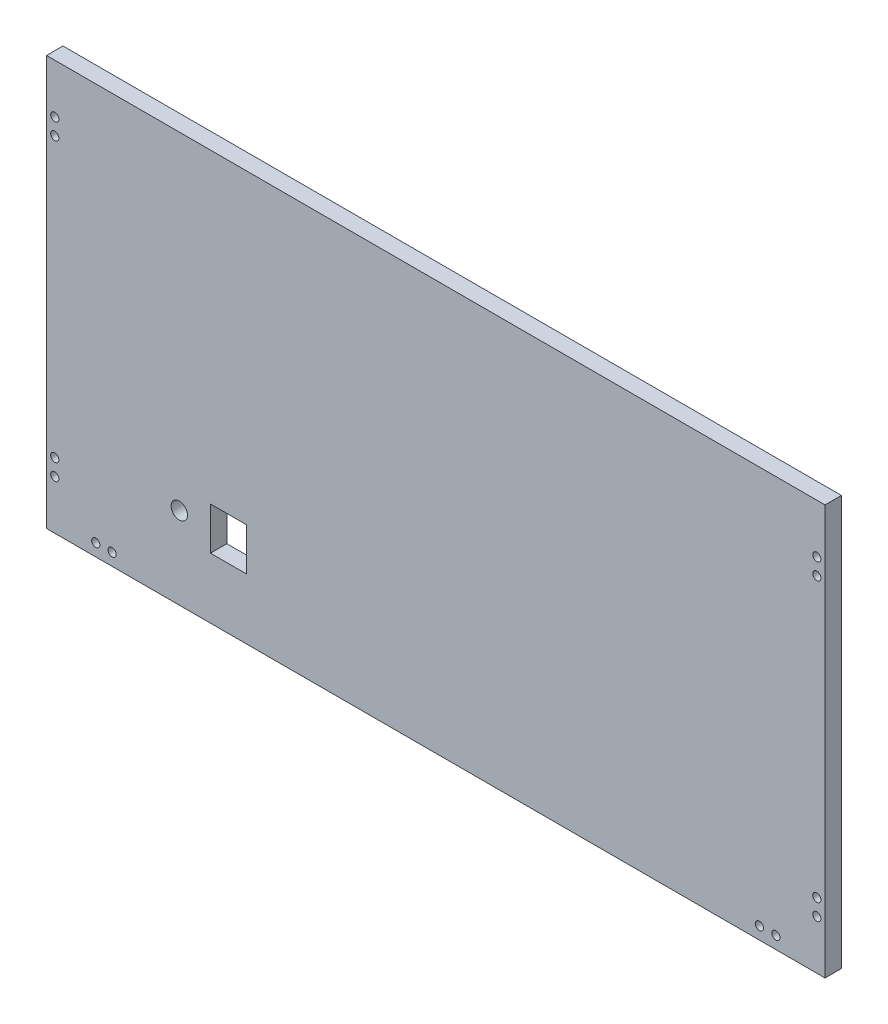
ISO-10303-21;
HEADER;
FILE_DESCRIPTION(('STEP AP214'),'2;1');
FILE_NAME('part.step','',(''),(''),'','','');
FILE_SCHEMA(('AUTOMOTIVE_DESIGN { 1 0 10303 214 1 1 1 1 }'));
ENDSEC;
DATA;
#1=APPLICATION_CONTEXT('core data for automotive mechanical design processes');
#2=APPLICATION_PROTOCOL_DEFINITION('international standard','automotive_design',2000,#1);
#3=PRODUCT_CONTEXT('',#1,'mechanical');
#4=PRODUCT('Part','Part','',(#3));
#5=PRODUCT_RELATED_PRODUCT_CATEGORY('part','',(#4));
#6=PRODUCT_DEFINITION_FORMATION('','',#4);
#7=PRODUCT_DEFINITION_CONTEXT('part definition',#1,'design');
#8=PRODUCT_DEFINITION('design','',#6,#7);
#9=PRODUCT_DEFINITION_SHAPE('','',#8);
#10=(LENGTH_UNIT() NAMED_UNIT(*) SI_UNIT(.MILLI.,.METRE.));
#11=(NAMED_UNIT(*) PLANE_ANGLE_UNIT() SI_UNIT($,.RADIAN.));
#12=(NAMED_UNIT(*) SI_UNIT($,.STERADIAN.) SOLID_ANGLE_UNIT());
#13=UNCERTAINTY_MEASURE_WITH_UNIT(LENGTH_MEASURE(1.E-05),#10,'distance_accuracy_value','');
#14=(GEOMETRIC_REPRESENTATION_CONTEXT(3) GLOBAL_UNCERTAINTY_ASSIGNED_CONTEXT((#13)) GLOBAL_UNIT_ASSIGNED_CONTEXT((#10,
#11,#12)) REPRESENTATION_CONTEXT('',''));
#15=CARTESIAN_POINT('',(0.,0.,0.));
#16=DIRECTION('',(0.,0.,1.));
#17=DIRECTION('',(1.,0.,0.));
#18=AXIS2_PLACEMENT_3D('',#15,#16,#17);
#19=CARTESIAN_POINT('',(237.5,125.,10.));
#20=DIRECTION('',(-1.,0.,0.));
#21=DIRECTION('',(0.,-1.,0.));
#22=AXIS2_PLACEMENT_3D('',#19,#20,#21);
#23=PLANE('',#22);
#24=DIRECTION('',(0.,1.,0.));
#25=VECTOR('',#24,1.);
#26=CARTESIAN_POINT('',(237.5,125.,0.));
#27=LINE('',#26,#25);
#28=CARTESIAN_POINT('',(237.5,-125.,0.));
#29=VERTEX_POINT('',#28);
#30=CARTESIAN_POINT('',(237.5,125.,0.));
#31=VERTEX_POINT('',#30);
#32=EDGE_CURVE('E190',#29,#31,#27,.T.);
#33=ORIENTED_EDGE('',*,*,#32,.T.);
#34=DIRECTION('',(0.,0.,-1.));
#35=VECTOR('',#34,1.);
#36=CARTESIAN_POINT('',(237.5,125.,10.));
#37=LINE('',#36,#35);
#38=CARTESIAN_POINT('',(237.5,125.,10.));
#39=VERTEX_POINT('',#38);
#40=EDGE_CURVE('E11',#39,#31,#37,.T.);
#41=ORIENTED_EDGE('',*,*,#40,.F.);
#42=DIRECTION('',(0.,1.,0.));
#43=VECTOR('',#42,1.);
#44=CARTESIAN_POINT('',(237.5,125.,10.));
#45=LINE('',#44,#43);
#46=CARTESIAN_POINT('',(237.5,-125.,10.));
#47=VERTEX_POINT('',#46);
#48=EDGE_CURVE('E211',#47,#39,#45,.T.);
#49=ORIENTED_EDGE('',*,*,#48,.F.);
#50=DIRECTION('',(0.,0.,-1.));
#51=VECTOR('',#50,1.);
#52=CARTESIAN_POINT('',(237.5,-125.,10.));
#53=LINE('',#52,#51);
#54=EDGE_CURVE('E221',#47,#29,#53,.T.);
#55=ORIENTED_EDGE('',*,*,#54,.T.);
#56=EDGE_LOOP('',(#33,#41,#49,#55));
#57=FACE_BOUND('',#56,.T.);
#58=ADVANCED_FACE('F34',(#57),#23,.F.);
#59=CARTESIAN_POINT('',(-237.5,125.,10.));
#60=DIRECTION('',(0.,-1.,0.));
#61=DIRECTION('',(0.,0.,-1.));
#62=AXIS2_PLACEMENT_3D('',#59,#60,#61);
#63=PLANE('',#62);
#64=DIRECTION('',(-1.,0.,0.));
#65=VECTOR('',#64,1.);
#66=CARTESIAN_POINT('',(-237.5,125.,0.));
#67=LINE('',#66,#65);
#68=CARTESIAN_POINT('',(-237.5,125.,0.));
#69=VERTEX_POINT('',#68);
#70=EDGE_CURVE('E224',#31,#69,#67,.T.);
#71=ORIENTED_EDGE('',*,*,#70,.T.);
#72=DIRECTION('',(0.,0.,-1.));
#73=VECTOR('',#72,1.);
#74=CARTESIAN_POINT('',(-237.5,125.,10.));
#75=LINE('',#74,#73);
#76=CARTESIAN_POINT('',(-237.5,125.,10.));
#77=VERTEX_POINT('',#76);
#78=EDGE_CURVE('E41',#77,#69,#75,.T.);
#79=ORIENTED_EDGE('',*,*,#78,.F.);
#80=DIRECTION('',(-1.,0.,0.));
#81=VECTOR('',#80,1.);
#82=CARTESIAN_POINT('',(-237.5,125.,10.));
#83=LINE('',#82,#81);
#84=EDGE_CURVE('E214',#39,#77,#83,.T.);
#85=ORIENTED_EDGE('',*,*,#84,.F.);
#86=ORIENTED_EDGE('',*,*,#40,.T.);
#87=EDGE_LOOP('',(#71,#79,#85,#86));
#88=FACE_BOUND('',#87,.T.);
#89=ADVANCED_FACE('F253',(#88),#63,.F.);
#90=CARTESIAN_POINT('',(-237.5,125.,10.));
#91=DIRECTION('',(1.,0.,0.));
#92=DIRECTION('',(0.,1.,0.));
#93=AXIS2_PLACEMENT_3D('',#90,#91,#92);
#94=PLANE('',#93);
#95=DIRECTION('',(0.,-1.,0.));
#96=VECTOR('',#95,1.);
#97=CARTESIAN_POINT('',(-237.5,125.,0.));
#98=LINE('',#97,#96);
#99=CARTESIAN_POINT('',(-237.5,-125.,0.));
#100=VERTEX_POINT('',#99);
#101=EDGE_CURVE('E226',#69,#100,#98,.T.);
#102=ORIENTED_EDGE('',*,*,#101,.T.);
#103=DIRECTION('',(0.,0.,-1.));
#104=VECTOR('',#103,1.);
#105=CARTESIAN_POINT('',(-237.5,-125.,10.));
#106=LINE('',#105,#104);
#107=CARTESIAN_POINT('',(-237.5,-125.,10.));
#108=VERTEX_POINT('',#107);
#109=EDGE_CURVE('E231',#108,#100,#106,.T.);
#110=ORIENTED_EDGE('',*,*,#109,.F.);
#111=DIRECTION('',(0.,-1.,0.));
#112=VECTOR('',#111,1.);
#113=CARTESIAN_POINT('',(-237.5,125.,10.));
#114=LINE('',#113,#112);
#115=EDGE_CURVE('E217',#77,#108,#114,.T.);
#116=ORIENTED_EDGE('',*,*,#115,.F.);
#117=ORIENTED_EDGE('',*,*,#78,.T.);
#118=EDGE_LOOP('',(#102,#110,#116,#117));
#119=FACE_BOUND('',#118,.T.);
#120=ADVANCED_FACE('F238',(#119),#94,.F.);
#121=CARTESIAN_POINT('',(-237.5,-125.,10.));
#122=DIRECTION('',(0.,1.,0.));
#123=DIRECTION('',(0.,0.,1.));
#124=AXIS2_PLACEMENT_3D('',#121,#122,#123);
#125=PLANE('',#124);
#126=DIRECTION('',(1.,0.,0.));
#127=VECTOR('',#126,1.);
#128=CARTESIAN_POINT('',(-237.5,-125.,0.));
#129=LINE('',#128,#127);
#130=EDGE_CURVE('E215',#100,#29,#129,.T.);
#131=ORIENTED_EDGE('',*,*,#130,.T.);
#132=ORIENTED_EDGE('',*,*,#54,.F.);
#133=DIRECTION('',(1.,0.,0.));
#134=VECTOR('',#133,1.);
#135=CARTESIAN_POINT('',(-237.5,-125.,10.));
#136=LINE('',#135,#134);
#137=EDGE_CURVE('E219',#108,#47,#136,.T.);
#138=ORIENTED_EDGE('',*,*,#137,.F.);
#139=ORIENTED_EDGE('',*,*,#109,.T.);
#140=EDGE_LOOP('',(#131,#132,#138,#139));
#141=FACE_BOUND('',#140,.T.);
#142=ADVANCED_FACE('F247',(#141),#125,.F.);
#143=CARTESIAN_POINT('',(0.,0.,10.));
#144=DIRECTION('',(0.,0.,1.));
#145=DIRECTION('',(1.,0.,0.));
#146=AXIS2_PLACEMENT_3D('',#143,#144,#145);
#147=PLANE('',#146);
#148=CARTESIAN_POINT('',(-156.5,-75.,10.));
#149=DIRECTION('',(0.,0.,-1.));
#150=DIRECTION('',(-1.,0.,0.));
#151=AXIS2_PLACEMENT_3D('',#148,#149,#150);
#152=CIRCLE('',#151,4.99999999999999);
#153=CARTESIAN_POINT('',(-161.5,-75.,10.));
#154=VERTEX_POINT('',#153);
#155=EDGE_CURVE('E156',#154,#154,#152,.T.);
#156=ORIENTED_EDGE('',*,*,#155,.T.);
#157=EDGE_LOOP('',(#156));
#158=FACE_BOUND('',#157,.T.);
#159=DIRECTION('',(0.,1.,0.));
#160=VECTOR('',#159,1.);
#161=CARTESIAN_POINT('',(-137.5,-61.9999999999999,10.));
#162=LINE('',#161,#160);
#163=CARTESIAN_POINT('',(-137.5,-88.,10.));
#164=VERTEX_POINT('',#163);
#165=CARTESIAN_POINT('',(-137.5,-61.9999999999999,10.));
#166=VERTEX_POINT('',#165);
#167=EDGE_CURVE('E100',#164,#166,#162,.T.);
#168=ORIENTED_EDGE('',*,*,#167,.T.);
#169=DIRECTION('',(1.,0.,0.));
#170=VECTOR('',#169,1.);
#171=CARTESIAN_POINT('',(-115.5,-62.,10.));
#172=LINE('',#171,#170);
#173=CARTESIAN_POINT('',(-115.5,-62.,10.));
#174=VERTEX_POINT('',#173);
#175=EDGE_CURVE('E109',#166,#174,#172,.T.);
#176=ORIENTED_EDGE('',*,*,#175,.T.);
#177=DIRECTION('',(0.,-1.,0.));
#178=VECTOR('',#177,1.);
#179=CARTESIAN_POINT('',(-115.5,-62.,10.));
#180=LINE('',#179,#178);
#181=CARTESIAN_POINT('',(-115.5,-88.,10.));
#182=VERTEX_POINT('',#181);
#183=EDGE_CURVE('E48',#174,#182,#180,.T.);
#184=ORIENTED_EDGE('',*,*,#183,.T.);
#185=DIRECTION('',(-1.,0.,0.));
#186=VECTOR('',#185,1.);
#187=CARTESIAN_POINT('',(-115.5,-88.,10.));
#188=LINE('',#187,#186);
#189=EDGE_CURVE('E106',#182,#164,#188,.T.);
#190=ORIENTED_EDGE('',*,*,#189,.T.);
#191=EDGE_LOOP('',(#168,#176,#184,#190));
#192=FACE_BOUND('',#191,.T.);
#193=CARTESIAN_POINT('',(232.5,95.,10.));
#194=DIRECTION('',(0.,0.,-1.));
#195=DIRECTION('',(-1.,0.,0.));
#196=AXIS2_PLACEMENT_3D('',#193,#194,#195);
#197=CIRCLE('',#196,2.5);
#198=CARTESIAN_POINT('',(230.,95.,10.));
#199=VERTEX_POINT('',#198);
#200=EDGE_CURVE('E164',#199,#199,#197,.T.);
#201=ORIENTED_EDGE('',*,*,#200,.T.);
#202=EDGE_LOOP('',(#201));
#203=FACE_BOUND('',#202,.T.);
#204=CARTESIAN_POINT('',(-232.5,-95.,10.));
#205=DIRECTION('',(0.,0.,-1.));
#206=DIRECTION('',(-1.,0.,0.));
#207=AXIS2_PLACEMENT_3D('',#204,#205,#206);
#208=CIRCLE('',#207,2.5);
#209=CARTESIAN_POINT('',(-235.,-95.,10.));
#210=VERTEX_POINT('',#209);
#211=EDGE_CURVE('E157',#210,#210,#208,.T.);
#212=ORIENTED_EDGE('',*,*,#211,.T.);
#213=EDGE_LOOP('',(#212));
#214=FACE_BOUND('',#213,.T.);
#215=CARTESIAN_POINT('',(-232.5,-85.,10.));
#216=DIRECTION('',(0.,0.,-1.));
#217=DIRECTION('',(-1.,0.,0.));
#218=AXIS2_PLACEMENT_3D('',#215,#216,#217);
#219=CIRCLE('',#218,2.5);
#220=CARTESIAN_POINT('',(-235.,-85.,10.));
#221=VERTEX_POINT('',#220);
#222=EDGE_CURVE('E176',#221,#221,#219,.T.);
#223=ORIENTED_EDGE('',*,*,#222,.T.);
#224=EDGE_LOOP('',(#223));
#225=FACE_BOUND('',#224,.T.);
#226=CARTESIAN_POINT('',(-232.5,85.,10.));
#227=DIRECTION('',(0.,0.,-1.));
#228=DIRECTION('',(-1.,0.,0.));
#229=AXIS2_PLACEMENT_3D('',#226,#227,#228);
#230=CIRCLE('',#229,2.5);
#231=CARTESIAN_POINT('',(-235.,85.,10.));
#232=VERTEX_POINT('',#231);
#233=EDGE_CURVE('E169',#232,#232,#230,.T.);
#234=ORIENTED_EDGE('',*,*,#233,.T.);
#235=EDGE_LOOP('',(#234));
#236=FACE_BOUND('',#235,.T.);
#237=CARTESIAN_POINT('',(232.5,85.,10.));
#238=DIRECTION('',(0.,0.,-1.));
#239=DIRECTION('',(-1.,0.,0.));
#240=AXIS2_PLACEMENT_3D('',#237,#238,#239);
#241=CIRCLE('',#240,2.5);
#242=CARTESIAN_POINT('',(230.,85.,10.));
#243=VERTEX_POINT('',#242);
#244=EDGE_CURVE('E137',#243,#243,#241,.T.);
#245=ORIENTED_EDGE('',*,*,#244,.T.);
#246=EDGE_LOOP('',(#245));
#247=FACE_BOUND('',#246,.T.);
#248=CARTESIAN_POINT('',(232.5,-85.,10.));
#249=DIRECTION('',(0.,0.,-1.));
#250=DIRECTION('',(-1.,0.,0.));
#251=AXIS2_PLACEMENT_3D('',#248,#249,#250);
#252=CIRCLE('',#251,2.5);
#253=CARTESIAN_POINT('',(230.,-85.,10.));
#254=VERTEX_POINT('',#253);
#255=EDGE_CURVE('E144',#254,#254,#252,.T.);
#256=ORIENTED_EDGE('',*,*,#255,.T.);
#257=EDGE_LOOP('',(#256));
#258=FACE_BOUND('',#257,.T.);
#259=CARTESIAN_POINT('',(232.5,-95.,10.));
#260=DIRECTION('',(0.,0.,-1.));
#261=DIRECTION('',(-1.,0.,0.));
#262=AXIS2_PLACEMENT_3D('',#259,#260,#261);
#263=CIRCLE('',#262,2.5);
#264=CARTESIAN_POINT('',(230.,-95.,10.));
#265=VERTEX_POINT('',#264);
#266=EDGE_CURVE('E150',#265,#265,#263,.T.);
#267=ORIENTED_EDGE('',*,*,#266,.T.);
#268=EDGE_LOOP('',(#267));
#269=FACE_BOUND('',#268,.T.);
#270=CARTESIAN_POINT('',(-232.5,95.,10.));
#271=DIRECTION('',(0.,0.,-1.));
#272=DIRECTION('',(-1.,0.,0.));
#273=AXIS2_PLACEMENT_3D('',#270,#271,#272);
#274=CIRCLE('',#273,2.5);
#275=CARTESIAN_POINT('',(-235.,95.,10.));
#276=VERTEX_POINT('',#275);
#277=EDGE_CURVE('E181',#276,#276,#274,.T.);
#278=ORIENTED_EDGE('',*,*,#277,.T.);
#279=EDGE_LOOP('',(#278));
#280=FACE_BOUND('',#279,.T.);
#281=CARTESIAN_POINT('',(-207.5,-117.5,10.));
#282=DIRECTION('',(0.,0.,1.));
#283=DIRECTION('',(1.,0.,0.));
#284=AXIS2_PLACEMENT_3D('',#281,#282,#283);
#285=CIRCLE('',#284,2.5);
#286=CARTESIAN_POINT('',(-205.,-117.5,10.));
#287=VERTEX_POINT('',#286);
#288=EDGE_CURVE('E191',#287,#287,#285,.T.);
#289=ORIENTED_EDGE('',*,*,#288,.F.);
#290=EDGE_LOOP('',(#289));
#291=FACE_BOUND('',#290,.T.);
#292=CARTESIAN_POINT('',(207.5,-117.5,10.));
#293=DIRECTION('',(0.,0.,1.));
#294=DIRECTION('',(1.,0.,0.));
#295=AXIS2_PLACEMENT_3D('',#292,#293,#294);
#296=CIRCLE('',#295,2.5);
#297=CARTESIAN_POINT('',(210.,-117.5,10.));
#298=VERTEX_POINT('',#297);
#299=EDGE_CURVE('E197',#298,#298,#296,.T.);
#300=ORIENTED_EDGE('',*,*,#299,.F.);
#301=EDGE_LOOP('',(#300));
#302=FACE_BOUND('',#301,.T.);
#303=CARTESIAN_POINT('',(197.5,-117.5,10.));
#304=DIRECTION('',(0.,0.,1.));
#305=DIRECTION('',(1.,0.,0.));
#306=AXIS2_PLACEMENT_3D('',#303,#304,#305);
#307=CIRCLE('',#306,2.5);
#308=CARTESIAN_POINT('',(200.,-117.5,10.));
#309=VERTEX_POINT('',#308);
#310=EDGE_CURVE('E203',#309,#309,#307,.T.);
#311=ORIENTED_EDGE('',*,*,#310,.F.);
#312=EDGE_LOOP('',(#311));
#313=FACE_BOUND('',#312,.T.);
#314=CARTESIAN_POINT('',(-197.5,-117.5,10.));
#315=DIRECTION('',(0.,0.,1.));
#316=DIRECTION('',(1.,0.,0.));
#317=AXIS2_PLACEMENT_3D('',#314,#315,#316);
#318=CIRCLE('',#317,2.5);
#319=CARTESIAN_POINT('',(-195.,-117.5,10.));
#320=VERTEX_POINT('',#319);
#321=EDGE_CURVE('E184',#320,#320,#318,.T.);
#322=ORIENTED_EDGE('',*,*,#321,.F.);
#323=EDGE_LOOP('',(#322));
#324=FACE_BOUND('',#323,.T.);
#325=ORIENTED_EDGE('',*,*,#48,.T.);
#326=ORIENTED_EDGE('',*,*,#84,.T.);
#327=ORIENTED_EDGE('',*,*,#115,.T.);
#328=ORIENTED_EDGE('',*,*,#137,.T.);
#329=EDGE_LOOP('',(#325,#326,#327,#328));
#330=FACE_BOUND('',#329,.T.);
#331=ADVANCED_FACE('F113',(#158,#192,#203,#214,#225,#236,#247,#258,#269,#280,#291,#302,#313,
#324,#330),#147,.T.);
#332=CARTESIAN_POINT('',(0.,0.,0.));
#333=DIRECTION('',(0.,0.,1.));
#334=DIRECTION('',(1.,0.,0.));
#335=AXIS2_PLACEMENT_3D('',#332,#333,#334);
#336=PLANE('',#335);
#337=CARTESIAN_POINT('',(-156.5,-75.,0.));
#338=DIRECTION('',(0.,0.,-1.));
#339=DIRECTION('',(-1.,0.,0.));
#340=AXIS2_PLACEMENT_3D('',#337,#338,#339);
#341=CIRCLE('',#340,4.99999999999999);
#342=CARTESIAN_POINT('',(-161.5,-75.,0.));
#343=VERTEX_POINT('',#342);
#344=EDGE_CURVE('E122',#343,#343,#341,.T.);
#345=ORIENTED_EDGE('',*,*,#344,.F.);
#346=EDGE_LOOP('',(#345));
#347=FACE_BOUND('',#346,.T.);
#348=DIRECTION('',(1.,0.,0.));
#349=VECTOR('',#348,1.);
#350=CARTESIAN_POINT('',(-115.5,-62.,0.));
#351=LINE('',#350,#349);
#352=CARTESIAN_POINT('',(-137.5,-61.9999999999999,0.));
#353=VERTEX_POINT('',#352);
#354=CARTESIAN_POINT('',(-115.5,-62.,0.));
#355=VERTEX_POINT('',#354);
#356=EDGE_CURVE('E128',#353,#355,#351,.T.);
#357=ORIENTED_EDGE('',*,*,#356,.F.);
#358=DIRECTION('',(0.,1.,0.));
#359=VECTOR('',#358,1.);
#360=CARTESIAN_POINT('',(-137.5,-61.9999999999999,0.));
#361=LINE('',#360,#359);
#362=CARTESIAN_POINT('',(-137.5,-88.,0.));
#363=VERTEX_POINT('',#362);
#364=EDGE_CURVE('E56',#363,#353,#361,.T.);
#365=ORIENTED_EDGE('',*,*,#364,.F.);
#366=DIRECTION('',(-1.,0.,0.));
#367=VECTOR('',#366,1.);
#368=CARTESIAN_POINT('',(-115.5,-88.,0.));
#369=LINE('',#368,#367);
#370=CARTESIAN_POINT('',(-115.5,-88.,0.));
#371=VERTEX_POINT('',#370);
#372=EDGE_CURVE('E116',#371,#363,#369,.T.);
#373=ORIENTED_EDGE('',*,*,#372,.F.);
#374=DIRECTION('',(0.,-1.,0.));
#375=VECTOR('',#374,1.);
#376=CARTESIAN_POINT('',(-115.5,-62.,0.));
#377=LINE('',#376,#375);
#378=EDGE_CURVE('E119',#355,#371,#377,.T.);
#379=ORIENTED_EDGE('',*,*,#378,.F.);
#380=EDGE_LOOP('',(#357,#365,#373,#379));
#381=FACE_BOUND('',#380,.T.);
#382=CARTESIAN_POINT('',(232.5,95.,0.));
#383=DIRECTION('',(0.,0.,-1.));
#384=DIRECTION('',(-1.,0.,0.));
#385=AXIS2_PLACEMENT_3D('',#382,#383,#384);
#386=CIRCLE('',#385,2.5);
#387=CARTESIAN_POINT('',(230.,95.,0.));
#388=VERTEX_POINT('',#387);
#389=EDGE_CURVE('E140',#388,#388,#386,.T.);
#390=ORIENTED_EDGE('',*,*,#389,.F.);
#391=EDGE_LOOP('',(#390));
#392=FACE_BOUND('',#391,.T.);
#393=CARTESIAN_POINT('',(-232.5,-95.,0.));
#394=DIRECTION('',(0.,0.,-1.));
#395=DIRECTION('',(-1.,0.,0.));
#396=AXIS2_PLACEMENT_3D('',#393,#394,#395);
#397=CIRCLE('',#396,2.5);
#398=CARTESIAN_POINT('',(-235.,-95.,0.));
#399=VERTEX_POINT('',#398);
#400=EDGE_CURVE('E161',#399,#399,#397,.T.);
#401=ORIENTED_EDGE('',*,*,#400,.F.);
#402=EDGE_LOOP('',(#401));
#403=FACE_BOUND('',#402,.T.);
#404=CARTESIAN_POINT('',(-232.5,-85.,0.));
#405=DIRECTION('',(0.,0.,-1.));
#406=DIRECTION('',(-1.,0.,0.));
#407=AXIS2_PLACEMENT_3D('',#404,#405,#406);
#408=CIRCLE('',#407,2.5);
#409=CARTESIAN_POINT('',(-235.,-85.,0.));
#410=VERTEX_POINT('',#409);
#411=EDGE_CURVE('E160',#410,#410,#408,.T.);
#412=ORIENTED_EDGE('',*,*,#411,.F.);
#413=EDGE_LOOP('',(#412));
#414=FACE_BOUND('',#413,.T.);
#415=CARTESIAN_POINT('',(-232.5,85.,0.));
#416=DIRECTION('',(0.,0.,-1.));
#417=DIRECTION('',(-1.,0.,0.));
#418=AXIS2_PLACEMENT_3D('',#415,#416,#417);
#419=CIRCLE('',#418,2.5);
#420=CARTESIAN_POINT('',(-235.,85.,0.));
#421=VERTEX_POINT('',#420);
#422=EDGE_CURVE('E173',#421,#421,#419,.T.);
#423=ORIENTED_EDGE('',*,*,#422,.F.);
#424=EDGE_LOOP('',(#423));
#425=FACE_BOUND('',#424,.T.);
#426=CARTESIAN_POINT('',(232.5,85.,0.));
#427=DIRECTION('',(0.,0.,-1.));
#428=DIRECTION('',(-1.,0.,0.));
#429=AXIS2_PLACEMENT_3D('',#426,#427,#428);
#430=CIRCLE('',#429,2.5);
#431=CARTESIAN_POINT('',(230.,85.,0.));
#432=VERTEX_POINT('',#431);
#433=EDGE_CURVE('E141',#432,#432,#430,.T.);
#434=ORIENTED_EDGE('',*,*,#433,.F.);
#435=EDGE_LOOP('',(#434));
#436=FACE_BOUND('',#435,.T.);
#437=CARTESIAN_POINT('',(232.5,-85.,0.));
#438=DIRECTION('',(0.,0.,-1.));
#439=DIRECTION('',(-1.,0.,0.));
#440=AXIS2_PLACEMENT_3D('',#437,#438,#439);
#441=CIRCLE('',#440,2.5);
#442=CARTESIAN_POINT('',(230.,-85.,0.));
#443=VERTEX_POINT('',#442);
#444=EDGE_CURVE('E147',#443,#443,#441,.T.);
#445=ORIENTED_EDGE('',*,*,#444,.F.);
#446=EDGE_LOOP('',(#445));
#447=FACE_BOUND('',#446,.T.);
#448=CARTESIAN_POINT('',(232.5,-95.,0.));
#449=DIRECTION('',(0.,0.,-1.));
#450=DIRECTION('',(-1.,0.,0.));
#451=AXIS2_PLACEMENT_3D('',#448,#449,#450);
#452=CIRCLE('',#451,2.5);
#453=CARTESIAN_POINT('',(230.,-95.,0.));
#454=VERTEX_POINT('',#453);
#455=EDGE_CURVE('E153',#454,#454,#452,.T.);
#456=ORIENTED_EDGE('',*,*,#455,.F.);
#457=EDGE_LOOP('',(#456));
#458=FACE_BOUND('',#457,.T.);
#459=CARTESIAN_POINT('',(-232.5,95.,0.));
#460=DIRECTION('',(0.,0.,-1.));
#461=DIRECTION('',(-1.,0.,0.));
#462=AXIS2_PLACEMENT_3D('',#459,#460,#461);
#463=CIRCLE('',#462,2.5);
#464=CARTESIAN_POINT('',(-235.,95.,0.));
#465=VERTEX_POINT('',#464);
#466=EDGE_CURVE('E172',#465,#465,#463,.T.);
#467=ORIENTED_EDGE('',*,*,#466,.F.);
#468=EDGE_LOOP('',(#467));
#469=FACE_BOUND('',#468,.T.);
#470=CARTESIAN_POINT('',(-207.5,-117.5,0.));
#471=DIRECTION('',(0.,0.,1.));
#472=DIRECTION('',(1.,0.,0.));
#473=AXIS2_PLACEMENT_3D('',#470,#471,#472);
#474=CIRCLE('',#473,2.5);
#475=CARTESIAN_POINT('',(-205.,-117.5,0.));
#476=VERTEX_POINT('',#475);
#477=EDGE_CURVE('E187',#476,#476,#474,.T.);
#478=ORIENTED_EDGE('',*,*,#477,.T.);
#479=EDGE_LOOP('',(#478));
#480=FACE_BOUND('',#479,.T.);
#481=CARTESIAN_POINT('',(207.5,-117.5,0.));
#482=DIRECTION('',(0.,0.,1.));
#483=DIRECTION('',(1.,0.,0.));
#484=AXIS2_PLACEMENT_3D('',#481,#482,#483);
#485=CIRCLE('',#484,2.5);
#486=CARTESIAN_POINT('',(210.,-117.5,0.));
#487=VERTEX_POINT('',#486);
#488=EDGE_CURVE('E194',#487,#487,#485,.T.);
#489=ORIENTED_EDGE('',*,*,#488,.T.);
#490=EDGE_LOOP('',(#489));
#491=FACE_BOUND('',#490,.T.);
#492=CARTESIAN_POINT('',(197.5,-117.5,0.));
#493=DIRECTION('',(0.,0.,1.));
#494=DIRECTION('',(1.,0.,0.));
#495=AXIS2_PLACEMENT_3D('',#492,#493,#494);
#496=CIRCLE('',#495,2.5);
#497=CARTESIAN_POINT('',(200.,-117.5,0.));
#498=VERTEX_POINT('',#497);
#499=EDGE_CURVE('E200',#498,#498,#496,.T.);
#500=ORIENTED_EDGE('',*,*,#499,.T.);
#501=EDGE_LOOP('',(#500));
#502=FACE_BOUND('',#501,.T.);
#503=CARTESIAN_POINT('',(-197.5,-117.5,0.));
#504=DIRECTION('',(0.,0.,1.));
#505=DIRECTION('',(1.,0.,0.));
#506=AXIS2_PLACEMENT_3D('',#503,#504,#505);
#507=CIRCLE('',#506,2.5);
#508=CARTESIAN_POINT('',(-195.,-117.5,0.));
#509=VERTEX_POINT('',#508);
#510=EDGE_CURVE('E206',#509,#509,#507,.T.);
#511=ORIENTED_EDGE('',*,*,#510,.T.);
#512=EDGE_LOOP('',(#511));
#513=FACE_BOUND('',#512,.T.);
#514=ORIENTED_EDGE('',*,*,#32,.F.);
#515=ORIENTED_EDGE('',*,*,#130,.F.);
#516=ORIENTED_EDGE('',*,*,#101,.F.);
#517=ORIENTED_EDGE('',*,*,#70,.F.);
#518=EDGE_LOOP('',(#514,#515,#516,#517));
#519=FACE_BOUND('',#518,.T.);
#520=ADVANCED_FACE('F244',(#347,#381,#392,#403,#414,#425,#436,#447,#458,#469,#480,#491,#502,
#513,#519),#336,.F.);
#521=CARTESIAN_POINT('',(-197.5,-117.5,0.));
#522=DIRECTION('',(0.,0.,1.));
#523=DIRECTION('',(1.,0.,0.));
#524=AXIS2_PLACEMENT_3D('',#521,#522,#523);
#525=CYLINDRICAL_SURFACE('',#524,2.5);
#526=ORIENTED_EDGE('',*,*,#510,.F.);
#527=EDGE_LOOP('',(#526));
#528=FACE_BOUND('',#527,.T.);
#529=ORIENTED_EDGE('',*,*,#321,.T.);
#530=EDGE_LOOP('',(#529));
#531=FACE_BOUND('',#530,.T.);
#532=ADVANCED_FACE('F265',(#528,#531),#525,.F.);
#533=CARTESIAN_POINT('',(197.5,-117.5,0.));
#534=DIRECTION('',(0.,0.,1.));
#535=DIRECTION('',(1.,0.,0.));
#536=AXIS2_PLACEMENT_3D('',#533,#534,#535);
#537=CYLINDRICAL_SURFACE('',#536,2.5);
#538=ORIENTED_EDGE('',*,*,#499,.F.);
#539=EDGE_LOOP('',(#538));
#540=FACE_BOUND('',#539,.T.);
#541=ORIENTED_EDGE('',*,*,#310,.T.);
#542=EDGE_LOOP('',(#541));
#543=FACE_BOUND('',#542,.T.);
#544=ADVANCED_FACE('F272',(#540,#543),#537,.F.);
#545=CARTESIAN_POINT('',(207.5,-117.5,0.));
#546=DIRECTION('',(0.,0.,1.));
#547=DIRECTION('',(1.,0.,0.));
#548=AXIS2_PLACEMENT_3D('',#545,#546,#547);
#549=CYLINDRICAL_SURFACE('',#548,2.5);
#550=ORIENTED_EDGE('',*,*,#488,.F.);
#551=EDGE_LOOP('',(#550));
#552=FACE_BOUND('',#551,.T.);
#553=ORIENTED_EDGE('',*,*,#299,.T.);
#554=EDGE_LOOP('',(#553));
#555=FACE_BOUND('',#554,.T.);
#556=ADVANCED_FACE('F276',(#552,#555),#549,.F.);
#557=CARTESIAN_POINT('',(-207.5,-117.5,0.));
#558=DIRECTION('',(0.,0.,1.));
#559=DIRECTION('',(1.,0.,0.));
#560=AXIS2_PLACEMENT_3D('',#557,#558,#559);
#561=CYLINDRICAL_SURFACE('',#560,2.5);
#562=ORIENTED_EDGE('',*,*,#477,.F.);
#563=EDGE_LOOP('',(#562));
#564=FACE_BOUND('',#563,.T.);
#565=ORIENTED_EDGE('',*,*,#288,.T.);
#566=EDGE_LOOP('',(#565));
#567=FACE_BOUND('',#566,.T.);
#568=ADVANCED_FACE('F280',(#564,#567),#561,.F.);
#569=CARTESIAN_POINT('',(-232.5,95.,10.));
#570=DIRECTION('',(0.,0.,-1.));
#571=DIRECTION('',(-1.,0.,0.));
#572=AXIS2_PLACEMENT_3D('',#569,#570,#571);
#573=CYLINDRICAL_SURFACE('',#572,2.5);
#574=ORIENTED_EDGE('',*,*,#277,.F.);
#575=EDGE_LOOP('',(#574));
#576=FACE_BOUND('',#575,.T.);
#577=ORIENTED_EDGE('',*,*,#466,.T.);
#578=EDGE_LOOP('',(#577));
#579=FACE_BOUND('',#578,.T.);
#580=ADVANCED_FACE('F284',(#576,#579),#573,.F.);
#581=CARTESIAN_POINT('',(232.5,-95.,10.));
#582=DIRECTION('',(0.,0.,-1.));
#583=DIRECTION('',(-1.,0.,0.));
#584=AXIS2_PLACEMENT_3D('',#581,#582,#583);
#585=CYLINDRICAL_SURFACE('',#584,2.5);
#586=ORIENTED_EDGE('',*,*,#266,.F.);
#587=EDGE_LOOP('',(#586));
#588=FACE_BOUND('',#587,.T.);
#589=ORIENTED_EDGE('',*,*,#455,.T.);
#590=EDGE_LOOP('',(#589));
#591=FACE_BOUND('',#590,.T.);
#592=ADVANCED_FACE('F288',(#588,#591),#585,.F.);
#593=CARTESIAN_POINT('',(232.5,-85.,10.));
#594=DIRECTION('',(0.,0.,-1.));
#595=DIRECTION('',(-1.,0.,0.));
#596=AXIS2_PLACEMENT_3D('',#593,#594,#595);
#597=CYLINDRICAL_SURFACE('',#596,2.5);
#598=ORIENTED_EDGE('',*,*,#255,.F.);
#599=EDGE_LOOP('',(#598));
#600=FACE_BOUND('',#599,.T.);
#601=ORIENTED_EDGE('',*,*,#444,.T.);
#602=EDGE_LOOP('',(#601));
#603=FACE_BOUND('',#602,.T.);
#604=ADVANCED_FACE('F309',(#600,#603),#597,.F.);
#605=CARTESIAN_POINT('',(232.5,85.,10.));
#606=DIRECTION('',(0.,0.,-1.));
#607=DIRECTION('',(-1.,0.,0.));
#608=AXIS2_PLACEMENT_3D('',#605,#606,#607);
#609=CYLINDRICAL_SURFACE('',#608,2.5);
#610=ORIENTED_EDGE('',*,*,#244,.F.);
#611=EDGE_LOOP('',(#610));
#612=FACE_BOUND('',#611,.T.);
#613=ORIENTED_EDGE('',*,*,#433,.T.);
#614=EDGE_LOOP('',(#613));
#615=FACE_BOUND('',#614,.T.);
#616=ADVANCED_FACE('F298',(#612,#615),#609,.F.);
#617=CARTESIAN_POINT('',(-232.5,85.,10.));
#618=DIRECTION('',(0.,0.,-1.));
#619=DIRECTION('',(-1.,0.,0.));
#620=AXIS2_PLACEMENT_3D('',#617,#618,#619);
#621=CYLINDRICAL_SURFACE('',#620,2.5);
#622=ORIENTED_EDGE('',*,*,#233,.F.);
#623=EDGE_LOOP('',(#622));
#624=FACE_BOUND('',#623,.T.);
#625=ORIENTED_EDGE('',*,*,#422,.T.);
#626=EDGE_LOOP('',(#625));
#627=FACE_BOUND('',#626,.T.);
#628=ADVANCED_FACE('F294',(#624,#627),#621,.F.);
#629=CARTESIAN_POINT('',(-232.5,-85.,10.));
#630=DIRECTION('',(0.,0.,-1.));
#631=DIRECTION('',(-1.,0.,0.));
#632=AXIS2_PLACEMENT_3D('',#629,#630,#631);
#633=CYLINDRICAL_SURFACE('',#632,2.5);
#634=ORIENTED_EDGE('',*,*,#222,.F.);
#635=EDGE_LOOP('',(#634));
#636=FACE_BOUND('',#635,.T.);
#637=ORIENTED_EDGE('',*,*,#411,.T.);
#638=EDGE_LOOP('',(#637));
#639=FACE_BOUND('',#638,.T.);
#640=ADVANCED_FACE('F290',(#636,#639),#633,.F.);
#641=CARTESIAN_POINT('',(-232.5,-95.,10.));
#642=DIRECTION('',(0.,0.,-1.));
#643=DIRECTION('',(-1.,0.,0.));
#644=AXIS2_PLACEMENT_3D('',#641,#642,#643);
#645=CYLINDRICAL_SURFACE('',#644,2.5);
#646=ORIENTED_EDGE('',*,*,#211,.F.);
#647=EDGE_LOOP('',(#646));
#648=FACE_BOUND('',#647,.T.);
#649=ORIENTED_EDGE('',*,*,#400,.T.);
#650=EDGE_LOOP('',(#649));
#651=FACE_BOUND('',#650,.T.);
#652=ADVANCED_FACE('F293',(#648,#651),#645,.F.);
#653=CARTESIAN_POINT('',(232.5,95.,10.));
#654=DIRECTION('',(0.,0.,-1.));
#655=DIRECTION('',(-1.,0.,0.));
#656=AXIS2_PLACEMENT_3D('',#653,#654,#655);
#657=CYLINDRICAL_SURFACE('',#656,2.5);
#658=ORIENTED_EDGE('',*,*,#200,.F.);
#659=EDGE_LOOP('',(#658));
#660=FACE_BOUND('',#659,.T.);
#661=ORIENTED_EDGE('',*,*,#389,.T.);
#662=EDGE_LOOP('',(#661));
#663=FACE_BOUND('',#662,.T.);
#664=ADVANCED_FACE('F300',(#660,#663),#657,.F.);
#665=CARTESIAN_POINT('',(-137.5,-61.9999999999999,10.));
#666=DIRECTION('',(-1.,0.,0.));
#667=DIRECTION('',(0.,0.,1.));
#668=AXIS2_PLACEMENT_3D('',#665,#666,#667);
#669=PLANE('',#668);
#670=ORIENTED_EDGE('',*,*,#364,.T.);
#671=DIRECTION('',(0.,0.,-1.));
#672=VECTOR('',#671,1.);
#673=CARTESIAN_POINT('',(-137.5,-61.9999999999999,10.));
#674=LINE('',#673,#672);
#675=EDGE_CURVE('E96',#166,#353,#674,.T.);
#676=ORIENTED_EDGE('',*,*,#675,.F.);
#677=ORIENTED_EDGE('',*,*,#167,.F.);
#678=DIRECTION('',(0.,0.,-1.));
#679=VECTOR('',#678,1.);
#680=CARTESIAN_POINT('',(-137.5,-88.,10.));
#681=LINE('',#680,#679);
#682=EDGE_CURVE('E132',#164,#363,#681,.T.);
#683=ORIENTED_EDGE('',*,*,#682,.T.);
#684=EDGE_LOOP('',(#670,#676,#677,#683));
#685=FACE_BOUND('',#684,.T.);
#686=ADVANCED_FACE('F98',(#685),#669,.F.);
#687=CARTESIAN_POINT('',(-115.5,-88.,10.));
#688=DIRECTION('',(0.,-1.,0.));
#689=DIRECTION('',(0.,0.,-1.));
#690=AXIS2_PLACEMENT_3D('',#687,#688,#689);
#691=PLANE('',#690);
#692=ORIENTED_EDGE('',*,*,#372,.T.);
#693=ORIENTED_EDGE('',*,*,#682,.F.);
#694=ORIENTED_EDGE('',*,*,#189,.F.);
#695=DIRECTION('',(0.,0.,-1.));
#696=VECTOR('',#695,1.);
#697=CARTESIAN_POINT('',(-115.5,-88.,10.));
#698=LINE('',#697,#696);
#699=EDGE_CURVE('E134',#182,#371,#698,.T.);
#700=ORIENTED_EDGE('',*,*,#699,.T.);
#701=EDGE_LOOP('',(#692,#693,#694,#700));
#702=FACE_BOUND('',#701,.T.);
#703=ADVANCED_FACE('F319',(#702),#691,.F.);
#704=CARTESIAN_POINT('',(-115.5,-62.,10.));
#705=DIRECTION('',(1.,0.,0.));
#706=DIRECTION('',(0.,1.,0.));
#707=AXIS2_PLACEMENT_3D('',#704,#705,#706);
#708=PLANE('',#707);
#709=ORIENTED_EDGE('',*,*,#378,.T.);
#710=ORIENTED_EDGE('',*,*,#699,.F.);
#711=ORIENTED_EDGE('',*,*,#183,.F.);
#712=DIRECTION('',(0.,0.,-1.));
#713=VECTOR('',#712,1.);
#714=CARTESIAN_POINT('',(-115.5,-62.,10.));
#715=LINE('',#714,#713);
#716=EDGE_CURVE('E105',#174,#355,#715,.T.);
#717=ORIENTED_EDGE('',*,*,#716,.T.);
#718=EDGE_LOOP('',(#709,#710,#711,#717));
#719=FACE_BOUND('',#718,.T.);
#720=ADVANCED_FACE('F323',(#719),#708,.F.);
#721=CARTESIAN_POINT('',(-115.5,-62.,10.));
#722=DIRECTION('',(0.,1.,0.));
#723=DIRECTION('',(-1.,0.,0.));
#724=AXIS2_PLACEMENT_3D('',#721,#722,#723);
#725=PLANE('',#724);
#726=ORIENTED_EDGE('',*,*,#356,.T.);
#727=ORIENTED_EDGE('',*,*,#716,.F.);
#728=ORIENTED_EDGE('',*,*,#175,.F.);
#729=ORIENTED_EDGE('',*,*,#675,.T.);
#730=EDGE_LOOP('',(#726,#727,#728,#729));
#731=FACE_BOUND('',#730,.T.);
#732=ADVANCED_FACE('F110',(#731),#725,.F.);
#733=CARTESIAN_POINT('',(-156.5,-75.,10.));
#734=DIRECTION('',(0.,0.,-1.));
#735=DIRECTION('',(-1.,0.,0.));
#736=AXIS2_PLACEMENT_3D('',#733,#734,#735);
#737=CYLINDRICAL_SURFACE('',#736,4.99999999999999);
#738=ORIENTED_EDGE('',*,*,#155,.F.);
#739=EDGE_LOOP('',(#738));
#740=FACE_BOUND('',#739,.T.);
#741=ORIENTED_EDGE('',*,*,#344,.T.);
#742=EDGE_LOOP('',(#741));
#743=FACE_BOUND('',#742,.T.);
#744=ADVANCED_FACE('F322',(#740,#743),#737,.F.);
#745=CLOSED_SHELL('',(#58,#89,#120,#142,#331,#520,#532,#544,#556,#568,#580,#592,#604,#616,#628,
#640,#652,#664,#686,#703,#720,#732,#744));
#746=MANIFOLD_SOLID_BREP('B2',#745);
#747=ADVANCED_BREP_SHAPE_REPRESENTATION('',(#18,#746),#14);
#748=SHAPE_DEFINITION_REPRESENTATION(#9,#747);
ENDSEC;
END-ISO-10303-21;
